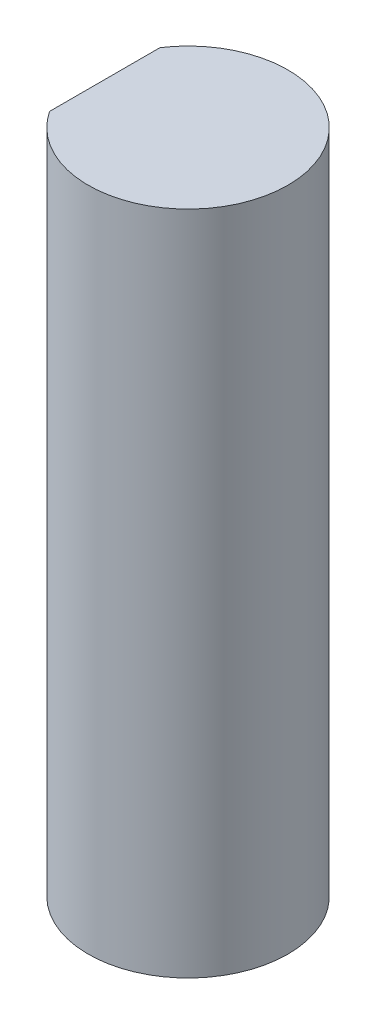
ISO-10303-21;
HEADER;
FILE_DESCRIPTION(('STEP AP214'),'2;1');
FILE_NAME('part.step','',(''),(''),'','','');
FILE_SCHEMA(('AUTOMOTIVE_DESIGN { 1 0 10303 214 1 1 1 1 }'));
ENDSEC;
DATA;
#1=APPLICATION_CONTEXT('core data for automotive mechanical design processes');
#2=APPLICATION_PROTOCOL_DEFINITION('international standard','automotive_design',2000,#1);
#3=PRODUCT_CONTEXT('',#1,'mechanical');
#4=PRODUCT('Part','Part','',(#3));
#5=PRODUCT_RELATED_PRODUCT_CATEGORY('part','',(#4));
#6=PRODUCT_DEFINITION_FORMATION('','',#4);
#7=PRODUCT_DEFINITION_CONTEXT('part definition',#1,'design');
#8=PRODUCT_DEFINITION('design','',#6,#7);
#9=PRODUCT_DEFINITION_SHAPE('','',#8);
#10=(LENGTH_UNIT() NAMED_UNIT(*) SI_UNIT(.MILLI.,.METRE.));
#11=(NAMED_UNIT(*) PLANE_ANGLE_UNIT() SI_UNIT($,.RADIAN.));
#12=(NAMED_UNIT(*) SI_UNIT($,.STERADIAN.) SOLID_ANGLE_UNIT());
#13=UNCERTAINTY_MEASURE_WITH_UNIT(LENGTH_MEASURE(1.E-05),#10,'distance_accuracy_value','');
#14=(GEOMETRIC_REPRESENTATION_CONTEXT(3) GLOBAL_UNCERTAINTY_ASSIGNED_CONTEXT((#13)) GLOBAL_UNIT_ASSIGNED_CONTEXT((#10,
#11,#12)) REPRESENTATION_CONTEXT('',''));
#15=CARTESIAN_POINT('',(0.,0.,0.));
#16=DIRECTION('',(0.,0.,1.));
#17=DIRECTION('',(1.,0.,0.));
#18=AXIS2_PLACEMENT_3D('',#15,#16,#17);
#19=CARTESIAN_POINT('',(0.,20.,0.));
#20=DIRECTION('',(0.,-1.,0.));
#21=DIRECTION('',(0.,0.,-1.));
#22=AXIS2_PLACEMENT_3D('',#19,#20,#21);
#23=CYLINDRICAL_SURFACE('',#22,3.);
#24=CARTESIAN_POINT('',(0.,0.,0.));
#25=DIRECTION('',(0.,1.,0.));
#26=DIRECTION('',(0.,0.,1.));
#27=AXIS2_PLACEMENT_3D('',#24,#25,#26);
#28=CIRCLE('',#27,3.);
#29=CARTESIAN_POINT('',(-2.5,0.,1.6583123951777));
#30=VERTEX_POINT('',#29);
#31=CARTESIAN_POINT('',(-2.5,0.,-1.6583123951777));
#32=VERTEX_POINT('',#31);
#33=EDGE_CURVE('E68',#30,#32,#28,.T.);
#34=ORIENTED_EDGE('',*,*,#33,.T.);
#35=DIRECTION('',(0.,-1.,0.));
#36=VECTOR('',#35,1.);
#37=CARTESIAN_POINT('',(-2.5,20.,-1.6583123951777));
#38=LINE('',#37,#36);
#39=CARTESIAN_POINT('',(-2.5,20.,-1.6583123951777));
#40=VERTEX_POINT('',#39);
#41=EDGE_CURVE('E11',#40,#32,#38,.T.);
#42=ORIENTED_EDGE('',*,*,#41,.F.);
#43=CARTESIAN_POINT('',(0.,20.,0.));
#44=DIRECTION('',(0.,1.,0.));
#45=DIRECTION('',(0.,0.,1.));
#46=AXIS2_PLACEMENT_3D('',#43,#44,#45);
#47=CIRCLE('',#46,3.);
#48=CARTESIAN_POINT('',(-2.5,20.,1.6583123951777));
#49=VERTEX_POINT('',#48);
#50=EDGE_CURVE('E67',#49,#40,#47,.T.);
#51=ORIENTED_EDGE('',*,*,#50,.F.);
#52=DIRECTION('',(0.,-1.,0.));
#53=VECTOR('',#52,1.);
#54=CARTESIAN_POINT('',(-2.5,20.,1.6583123951777));
#55=LINE('',#54,#53);
#56=EDGE_CURVE('E45',#49,#30,#55,.T.);
#57=ORIENTED_EDGE('',*,*,#56,.T.);
#58=EDGE_LOOP('',(#34,#42,#51,#57));
#59=FACE_BOUND('',#58,.T.);
#60=ADVANCED_FACE('F37',(#59),#23,.T.);
#61=CARTESIAN_POINT('',(-2.5,20.,-1.6583123951777));
#62=DIRECTION('',(1.,0.,0.));
#63=DIRECTION('',(0.,0.,-1.));
#64=AXIS2_PLACEMENT_3D('',#61,#62,#63);
#65=PLANE('',#64);
#66=DIRECTION('',(0.,0.,1.));
#67=VECTOR('',#66,1.);
#68=CARTESIAN_POINT('',(-2.5,0.,-1.6583123951777));
#69=LINE('',#68,#67);
#70=EDGE_CURVE('E60',#32,#30,#69,.T.);
#71=ORIENTED_EDGE('',*,*,#70,.T.);
#72=ORIENTED_EDGE('',*,*,#56,.F.);
#73=DIRECTION('',(0.,0.,1.));
#74=VECTOR('',#73,1.);
#75=CARTESIAN_POINT('',(-2.5,20.,-1.6583123951777));
#76=LINE('',#75,#74);
#77=EDGE_CURVE('E52',#40,#49,#76,.T.);
#78=ORIENTED_EDGE('',*,*,#77,.F.);
#79=ORIENTED_EDGE('',*,*,#41,.T.);
#80=EDGE_LOOP('',(#71,#72,#78,#79));
#81=FACE_BOUND('',#80,.T.);
#82=ADVANCED_FACE('F63',(#81),#65,.F.);
#83=CARTESIAN_POINT('',(0.,20.,0.));
#84=DIRECTION('',(0.,1.,0.));
#85=DIRECTION('',(0.,0.,1.));
#86=AXIS2_PLACEMENT_3D('',#83,#84,#85);
#87=PLANE('',#86);
#88=ORIENTED_EDGE('',*,*,#50,.T.);
#89=ORIENTED_EDGE('',*,*,#77,.T.);
#90=EDGE_LOOP('',(#88,#89));
#91=FACE_BOUND('',#90,.T.);
#92=ADVANCED_FACE('F75',(#91),#87,.T.);
#93=CARTESIAN_POINT('',(0.,0.,0.));
#94=DIRECTION('',(0.,1.,0.));
#95=DIRECTION('',(0.,0.,1.));
#96=AXIS2_PLACEMENT_3D('',#93,#94,#95);
#97=PLANE('',#96);
#98=ORIENTED_EDGE('',*,*,#33,.F.);
#99=ORIENTED_EDGE('',*,*,#70,.F.);
#100=EDGE_LOOP('',(#98,#99));
#101=FACE_BOUND('',#100,.T.);
#102=ADVANCED_FACE('F71',(#101),#97,.F.);
#103=CLOSED_SHELL('',(#60,#82,#92,#102));
#104=MANIFOLD_SOLID_BREP('B2',#103);
#105=ADVANCED_BREP_SHAPE_REPRESENTATION('',(#18,#104),#14);
#106=SHAPE_DEFINITION_REPRESENTATION(#9,#105);
ENDSEC;
END-ISO-10303-21;
